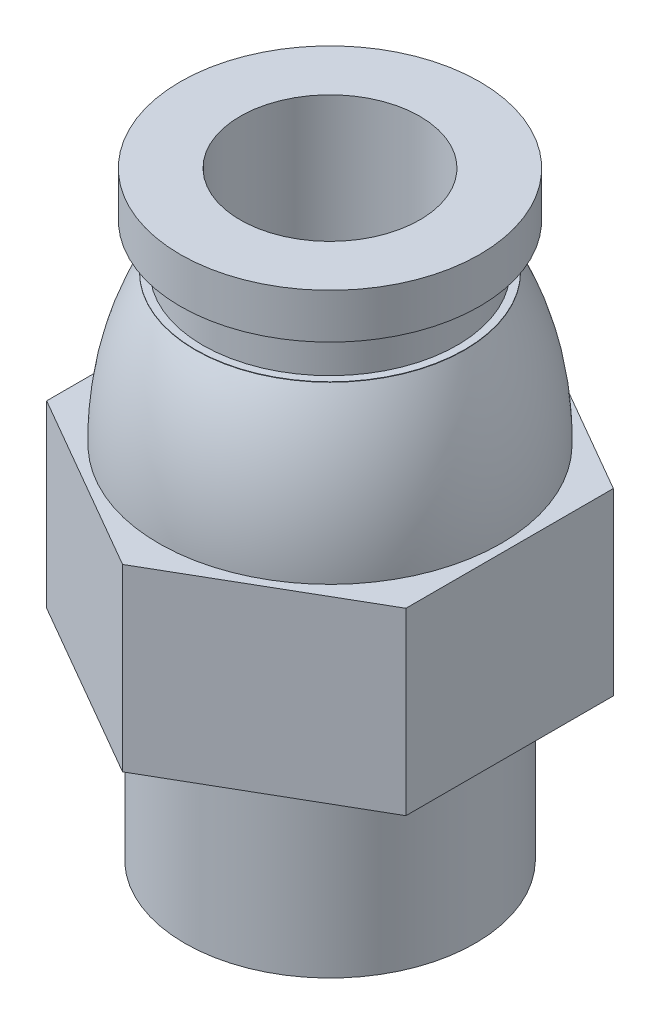
ISO-10303-21;
HEADER;
FILE_DESCRIPTION(('STEP AP214'),'2;1');
FILE_NAME('part.step','',(''),(''),'','','');
FILE_SCHEMA(('AUTOMOTIVE_DESIGN { 1 0 10303 214 1 1 1 1 }'));
ENDSEC;
DATA;
#1=APPLICATION_CONTEXT('core data for automotive mechanical design processes');
#2=APPLICATION_PROTOCOL_DEFINITION('international standard','automotive_design',2000,#1);
#3=PRODUCT_CONTEXT('',#1,'mechanical');
#4=PRODUCT('Part','Part','',(#3));
#5=PRODUCT_RELATED_PRODUCT_CATEGORY('part','',(#4));
#6=PRODUCT_DEFINITION_FORMATION('','',#4);
#7=PRODUCT_DEFINITION_CONTEXT('part definition',#1,'design');
#8=PRODUCT_DEFINITION('design','',#6,#7);
#9=PRODUCT_DEFINITION_SHAPE('','',#8);
#10=(LENGTH_UNIT() NAMED_UNIT(*) SI_UNIT(.MILLI.,.METRE.));
#11=(NAMED_UNIT(*) PLANE_ANGLE_UNIT() SI_UNIT($,.RADIAN.));
#12=(NAMED_UNIT(*) SI_UNIT($,.STERADIAN.) SOLID_ANGLE_UNIT());
#13=UNCERTAINTY_MEASURE_WITH_UNIT(LENGTH_MEASURE(1.E-05),#10,'distance_accuracy_value','');
#14=(GEOMETRIC_REPRESENTATION_CONTEXT(3) GLOBAL_UNCERTAINTY_ASSIGNED_CONTEXT((#13)) GLOBAL_UNIT_ASSIGNED_CONTEXT((#10,
#11,#12)) REPRESENTATION_CONTEXT('',''));
#15=CARTESIAN_POINT('',(0.,0.,0.));
#16=DIRECTION('',(0.,0.,1.));
#17=DIRECTION('',(1.,0.,0.));
#18=AXIS2_PLACEMENT_3D('',#15,#16,#17);
#19=CARTESIAN_POINT('',(0.,17.,0.));
#20=DIRECTION('',(0.,-1.,0.));
#21=DIRECTION('',(0.,0.,-1.));
#22=AXIS2_PLACEMENT_3D('',#19,#20,#21);
#23=CYLINDRICAL_SURFACE('',#22,4.5);
#24=CARTESIAN_POINT('',(0.,17.,0.));
#25=DIRECTION('',(0.,1.,0.));
#26=DIRECTION('',(0.,0.,1.));
#27=AXIS2_PLACEMENT_3D('',#24,#25,#26);
#28=CIRCLE('',#27,4.5);
#29=CARTESIAN_POINT('',(0.,17.,4.5));
#30=VERTEX_POINT('',#29);
#31=EDGE_CURVE('E138',#30,#30,#28,.T.);
#32=ORIENTED_EDGE('',*,*,#31,.F.);
#33=EDGE_LOOP('',(#32));
#34=FACE_BOUND('',#33,.T.);
#35=CARTESIAN_POINT('',(0.,16.9863492427653,0.));
#36=DIRECTION('',(0.,-1.,0.));
#37=DIRECTION('',(1.,0.,0.));
#38=AXIS2_PLACEMENT_3D('',#35,#36,#37);
#39=CIRCLE('',#38,4.5);
#40=CARTESIAN_POINT('',(4.5,16.9863492427653,0.));
#41=VERTEX_POINT('',#40);
#42=EDGE_CURVE('E11',#41,#41,#39,.T.);
#43=ORIENTED_EDGE('',*,*,#42,.F.);
#44=EDGE_LOOP('',(#43));
#45=FACE_BOUND('',#44,.T.);
#46=ADVANCED_FACE('F47',(#34,#45),#23,.T.);
#47=CARTESIAN_POINT('',(0.,17.,0.));
#48=DIRECTION('',(0.,1.,0.));
#49=DIRECTION('',(0.,0.,1.));
#50=AXIS2_PLACEMENT_3D('',#47,#48,#49);
#51=PLANE('',#50);
#52=CARTESIAN_POINT('',(0.,17.,0.));
#53=DIRECTION('',(0.,1.,0.));
#54=DIRECTION('',(0.,0.,1.));
#55=AXIS2_PLACEMENT_3D('',#52,#53,#54);
#56=CIRCLE('',#55,4.25);
#57=CARTESIAN_POINT('',(0.,17.,4.25));
#58=VERTEX_POINT('',#57);
#59=EDGE_CURVE('E157',#58,#58,#56,.T.);
#60=ORIENTED_EDGE('',*,*,#59,.F.);
#61=EDGE_LOOP('',(#60));
#62=FACE_BOUND('',#61,.T.);
#63=ORIENTED_EDGE('',*,*,#31,.T.);
#64=EDGE_LOOP('',(#63));
#65=FACE_BOUND('',#64,.T.);
#66=ADVANCED_FACE('F180',(#62,#65),#51,.T.);
#67=CARTESIAN_POINT('',(0.,18.,0.));
#68=DIRECTION('',(0.,-1.,0.));
#69=DIRECTION('',(0.,0.,-1.));
#70=AXIS2_PLACEMENT_3D('',#67,#68,#69);
#71=CYLINDRICAL_SURFACE('',#70,4.25);
#72=CARTESIAN_POINT('',(0.,18.,0.));
#73=DIRECTION('',(0.,1.,0.));
#74=DIRECTION('',(0.,0.,1.));
#75=AXIS2_PLACEMENT_3D('',#72,#73,#74);
#76=CIRCLE('',#75,4.25);
#77=CARTESIAN_POINT('',(0.,18.,4.25));
#78=VERTEX_POINT('',#77);
#79=EDGE_CURVE('E229',#78,#78,#76,.T.);
#80=ORIENTED_EDGE('',*,*,#79,.F.);
#81=EDGE_LOOP('',(#80));
#82=FACE_BOUND('',#81,.T.);
#83=ORIENTED_EDGE('',*,*,#59,.T.);
#84=EDGE_LOOP('',(#83));
#85=FACE_BOUND('',#84,.T.);
#86=ADVANCED_FACE('F187',(#82,#85),#71,.T.);
#87=CARTESIAN_POINT('',(0.,18.,0.));
#88=DIRECTION('',(0.,1.,0.));
#89=DIRECTION('',(0.,0.,1.));
#90=AXIS2_PLACEMENT_3D('',#87,#88,#89);
#91=PLANE('',#90);
#92=CARTESIAN_POINT('',(0.,18.,0.));
#93=DIRECTION('',(0.,1.,0.));
#94=DIRECTION('',(0.,0.,1.));
#95=AXIS2_PLACEMENT_3D('',#92,#93,#94);
#96=CIRCLE('',#95,3.75);
#97=CARTESIAN_POINT('',(0.,18.,3.75));
#98=VERTEX_POINT('',#97);
#99=EDGE_CURVE('E56',#98,#98,#96,.T.);
#100=ORIENTED_EDGE('',*,*,#99,.F.);
#101=EDGE_LOOP('',(#100));
#102=FACE_BOUND('',#101,.T.);
#103=ORIENTED_EDGE('',*,*,#79,.T.);
#104=EDGE_LOOP('',(#103));
#105=FACE_BOUND('',#104,.T.);
#106=ADVANCED_FACE('F272',(#102,#105),#91,.T.);
#107=CARTESIAN_POINT('',(0.,18.5,0.));
#108=DIRECTION('',(0.,-1.,0.));
#109=DIRECTION('',(0.,0.,-1.));
#110=AXIS2_PLACEMENT_3D('',#107,#108,#109);
#111=CYLINDRICAL_SURFACE('',#110,3.75);
#112=CARTESIAN_POINT('',(0.,18.5,0.));
#113=DIRECTION('',(0.,1.,0.));
#114=DIRECTION('',(0.,0.,1.));
#115=AXIS2_PLACEMENT_3D('',#112,#113,#114);
#116=CIRCLE('',#115,3.75);
#117=CARTESIAN_POINT('',(0.,18.5,3.75));
#118=VERTEX_POINT('',#117);
#119=EDGE_CURVE('E234',#118,#118,#116,.T.);
#120=ORIENTED_EDGE('',*,*,#119,.F.);
#121=EDGE_LOOP('',(#120));
#122=FACE_BOUND('',#121,.T.);
#123=ORIENTED_EDGE('',*,*,#99,.T.);
#124=EDGE_LOOP('',(#123));
#125=FACE_BOUND('',#124,.T.);
#126=ADVANCED_FACE('F268',(#122,#125),#111,.T.);
#127=CARTESIAN_POINT('',(0.,20.,0.));
#128=DIRECTION('',(0.,-1.,0.));
#129=DIRECTION('',(0.,0.,-1.));
#130=AXIS2_PLACEMENT_3D('',#127,#128,#129);
#131=CYLINDRICAL_SURFACE('',#130,5.);
#132=CARTESIAN_POINT('',(0.,20.,0.));
#133=DIRECTION('',(0.,1.,0.));
#134=DIRECTION('',(0.,0.,1.));
#135=AXIS2_PLACEMENT_3D('',#132,#133,#134);
#136=CIRCLE('',#135,5.);
#137=CARTESIAN_POINT('',(0.,20.,5.));
#138=VERTEX_POINT('',#137);
#139=EDGE_CURVE('E239',#138,#138,#136,.T.);
#140=ORIENTED_EDGE('',*,*,#139,.F.);
#141=EDGE_LOOP('',(#140));
#142=FACE_BOUND('',#141,.T.);
#143=CARTESIAN_POINT('',(0.,18.5,0.));
#144=DIRECTION('',(0.,1.,0.));
#145=DIRECTION('',(0.,0.,1.));
#146=AXIS2_PLACEMENT_3D('',#143,#144,#145);
#147=CIRCLE('',#146,5.);
#148=CARTESIAN_POINT('',(0.,18.5,5.));
#149=VERTEX_POINT('',#148);
#150=EDGE_CURVE('E240',#149,#149,#147,.T.);
#151=ORIENTED_EDGE('',*,*,#150,.T.);
#152=EDGE_LOOP('',(#151));
#153=FACE_BOUND('',#152,.T.);
#154=ADVANCED_FACE('F262',(#142,#153),#131,.T.);
#155=CARTESIAN_POINT('',(0.,20.,0.));
#156=DIRECTION('',(0.,1.,0.));
#157=DIRECTION('',(0.,0.,1.));
#158=AXIS2_PLACEMENT_3D('',#155,#156,#157);
#159=PLANE('',#158);
#160=CARTESIAN_POINT('',(0.,20.,0.));
#161=DIRECTION('',(0.,-1.,0.));
#162=DIRECTION('',(0.,0.,-1.));
#163=AXIS2_PLACEMENT_3D('',#160,#161,#162);
#164=CIRCLE('',#163,3.);
#165=CARTESIAN_POINT('',(0.,20.,-3.));
#166=VERTEX_POINT('',#165);
#167=EDGE_CURVE('E248',#166,#166,#164,.T.);
#168=ORIENTED_EDGE('',*,*,#167,.T.);
#169=EDGE_LOOP('',(#168));
#170=FACE_BOUND('',#169,.T.);
#171=ORIENTED_EDGE('',*,*,#139,.T.);
#172=EDGE_LOOP('',(#171));
#173=FACE_BOUND('',#172,.T.);
#174=ADVANCED_FACE('F260',(#170,#173),#159,.T.);
#175=CARTESIAN_POINT('',(0.,18.5,0.));
#176=DIRECTION('',(0.,1.,0.));
#177=DIRECTION('',(0.,0.,1.));
#178=AXIS2_PLACEMENT_3D('',#175,#176,#177);
#179=PLANE('',#178);
#180=ORIENTED_EDGE('',*,*,#119,.T.);
#181=EDGE_LOOP('',(#180));
#182=FACE_BOUND('',#181,.T.);
#183=ORIENTED_EDGE('',*,*,#150,.F.);
#184=EDGE_LOOP('',(#183));
#185=FACE_BOUND('',#184,.T.);
#186=ADVANCED_FACE('F174',(#182,#185),#179,.F.);
#187=CARTESIAN_POINT('',(-4.5,16.9863492427653,0.));
#188=CARTESIAN_POINT('',(-5.75676714383066,14.6775989770754,0.));
#189=CARTESIAN_POINT('',(-5.71614298009977,12.,0.));
#190=B_SPLINE_CURVE_WITH_KNOTS('',2,(#187,#188,#189),.UNSPECIFIED.,.F.,.F.,(3,3),(0.,1.),.UNSPECIFIED.);
#191=CARTESIAN_POINT('',(0.,12.,0.));
#192=DIRECTION('',(0.,-1.,0.));
#193=AXIS1_PLACEMENT('',#191,#192);
#194=SURFACE_OF_REVOLUTION('',#190,#193);
#195=CARTESIAN_POINT('',(0.,12.,0.));
#196=DIRECTION('',(0.,-1.,0.));
#197=DIRECTION('',(1.,0.,0.));
#198=AXIS2_PLACEMENT_3D('',#195,#196,#197);
#199=CIRCLE('',#198,5.71614298009977);
#200=CARTESIAN_POINT('',(5.71614298009977,12.,0.));
#201=VERTEX_POINT('',#200);
#202=EDGE_CURVE('E243',#201,#201,#199,.T.);
#203=ORIENTED_EDGE('',*,*,#202,.F.);
#204=EDGE_LOOP('',(#203));
#205=FACE_BOUND('',#204,.T.);
#206=ORIENTED_EDGE('',*,*,#42,.T.);
#207=EDGE_LOOP('',(#206));
#208=FACE_BOUND('',#207,.T.);
#209=ADVANCED_FACE('F164',(#205,#208),#194,.T.);
#210=CARTESIAN_POINT('',(0.,0.,0.));
#211=DIRECTION('',(0.,1.,0.));
#212=DIRECTION('',(0.,0.,1.));
#213=AXIS2_PLACEMENT_3D('',#210,#211,#212);
#214=PLANE('',#213);
#215=CARTESIAN_POINT('',(0.,0.,0.));
#216=DIRECTION('',(0.,-1.,0.));
#217=DIRECTION('',(0.,0.,-1.));
#218=AXIS2_PLACEMENT_3D('',#215,#216,#217);
#219=CIRCLE('',#218,3.025);
#220=CARTESIAN_POINT('',(0.,0.,-3.025));
#221=VERTEX_POINT('',#220);
#222=EDGE_CURVE('E351',#221,#221,#219,.T.);
#223=ORIENTED_EDGE('',*,*,#222,.F.);
#224=EDGE_LOOP('',(#223));
#225=FACE_BOUND('',#224,.T.);
#226=CARTESIAN_POINT('',(0.,0.,0.));
#227=DIRECTION('',(0.,1.,0.));
#228=DIRECTION('',(0.,0.,1.));
#229=AXIS2_PLACEMENT_3D('',#226,#227,#228);
#230=CIRCLE('',#229,4.85);
#231=CARTESIAN_POINT('',(0.,0.,4.85));
#232=VERTEX_POINT('',#231);
#233=EDGE_CURVE('E154',#232,#232,#230,.T.);
#234=ORIENTED_EDGE('',*,*,#233,.F.);
#235=EDGE_LOOP('',(#234));
#236=FACE_BOUND('',#235,.T.);
#237=ADVANCED_FACE('F162',(#225,#236),#214,.F.);
#238=CARTESIAN_POINT('',(0.,6.,0.));
#239=DIRECTION('',(0.,-1.,0.));
#240=DIRECTION('',(0.,0.,-1.));
#241=AXIS2_PLACEMENT_3D('',#238,#239,#240);
#242=CYLINDRICAL_SURFACE('',#241,4.85);
#243=CARTESIAN_POINT('',(0.,6.,0.));
#244=DIRECTION('',(0.,1.,0.));
#245=DIRECTION('',(0.,0.,1.));
#246=AXIS2_PLACEMENT_3D('',#243,#244,#245);
#247=CIRCLE('',#246,4.85);
#248=CARTESIAN_POINT('',(0.,6.,4.85));
#249=VERTEX_POINT('',#248);
#250=EDGE_CURVE('E155',#249,#249,#247,.T.);
#251=ORIENTED_EDGE('',*,*,#250,.F.);
#252=EDGE_LOOP('',(#251));
#253=FACE_BOUND('',#252,.T.);
#254=ORIENTED_EDGE('',*,*,#233,.T.);
#255=EDGE_LOOP('',(#254));
#256=FACE_BOUND('',#255,.T.);
#257=ADVANCED_FACE('F49',(#253,#256),#242,.T.);
#258=CARTESIAN_POINT('',(0.,6.,0.));
#259=DIRECTION('',(0.,1.,0.));
#260=DIRECTION('',(0.,0.,1.));
#261=AXIS2_PLACEMENT_3D('',#258,#259,#260);
#262=PLANE('',#261);
#263=ORIENTED_EDGE('',*,*,#250,.T.);
#264=EDGE_LOOP('',(#263));
#265=FACE_BOUND('',#264,.T.);
#266=DIRECTION('',(0.,0.,-1.));
#267=VECTOR('',#266,1.);
#268=CARTESIAN_POINT('',(6.,6.,3.46410161513776));
#269=LINE('',#268,#267);
#270=CARTESIAN_POINT('',(6.,6.,3.46410161513776));
#271=VERTEX_POINT('',#270);
#272=CARTESIAN_POINT('',(6.,6.,-3.46410161513775));
#273=VERTEX_POINT('',#272);
#274=EDGE_CURVE('E134',#271,#273,#269,.T.);
#275=ORIENTED_EDGE('',*,*,#274,.F.);
#276=DIRECTION('',(0.866025403784439,0.,-0.5));
#277=VECTOR('',#276,1.);
#278=CARTESIAN_POINT('',(0.,6.,6.92820323027551));
#279=LINE('',#278,#277);
#280=CARTESIAN_POINT('',(0.,6.,6.92820323027551));
#281=VERTEX_POINT('',#280);
#282=EDGE_CURVE('E93',#281,#271,#279,.T.);
#283=ORIENTED_EDGE('',*,*,#282,.F.);
#284=DIRECTION('',(0.866025403784439,0.,0.5));
#285=VECTOR('',#284,1.);
#286=CARTESIAN_POINT('',(-6.,6.,3.46410161513776));
#287=LINE('',#286,#285);
#288=CARTESIAN_POINT('',(-6.,6.,3.46410161513776));
#289=VERTEX_POINT('',#288);
#290=EDGE_CURVE('E87',#289,#281,#287,.T.);
#291=ORIENTED_EDGE('',*,*,#290,.F.);
#292=DIRECTION('',(0.,0.,1.));
#293=VECTOR('',#292,1.);
#294=CARTESIAN_POINT('',(-6.,6.,-3.46410161513775));
#295=LINE('',#294,#293);
#296=CARTESIAN_POINT('',(-6.,6.,-3.46410161513775));
#297=VERTEX_POINT('',#296);
#298=EDGE_CURVE('E124',#297,#289,#295,.T.);
#299=ORIENTED_EDGE('',*,*,#298,.F.);
#300=DIRECTION('',(-0.866025403784438,0.,0.5));
#301=VECTOR('',#300,1.);
#302=CARTESIAN_POINT('',(0.,6.,-6.92820323027551));
#303=LINE('',#302,#301);
#304=CARTESIAN_POINT('',(0.,6.,-6.92820323027551));
#305=VERTEX_POINT('',#304);
#306=EDGE_CURVE('E140',#305,#297,#303,.T.);
#307=ORIENTED_EDGE('',*,*,#306,.F.);
#308=DIRECTION('',(-0.866025403784438,0.,-0.5));
#309=VECTOR('',#308,1.);
#310=CARTESIAN_POINT('',(6.,6.,-3.46410161513775));
#311=LINE('',#310,#309);
#312=EDGE_CURVE('E137',#273,#305,#311,.T.);
#313=ORIENTED_EDGE('',*,*,#312,.F.);
#314=EDGE_LOOP('',(#275,#283,#291,#299,#307,#313));
#315=FACE_BOUND('',#314,.T.);
#316=ADVANCED_FACE('F171',(#265,#315),#262,.F.);
#317=CARTESIAN_POINT('',(0.,12.,6.92820323027551));
#318=DIRECTION('',(-0.5,0.,-0.866025403784438));
#319=DIRECTION('',(-0.866025403784439,0.,0.5));
#320=AXIS2_PLACEMENT_3D('',#317,#318,#319);
#321=PLANE('',#320);
#322=ORIENTED_EDGE('',*,*,#282,.T.);
#323=DIRECTION('',(0.,-1.,0.));
#324=VECTOR('',#323,1.);
#325=CARTESIAN_POINT('',(6.,12.,3.46410161513776));
#326=LINE('',#325,#324);
#327=CARTESIAN_POINT('',(6.,12.,3.46410161513776));
#328=VERTEX_POINT('',#327);
#329=EDGE_CURVE('E130',#328,#271,#326,.T.);
#330=ORIENTED_EDGE('',*,*,#329,.F.);
#331=DIRECTION('',(0.866025403784439,0.,-0.5));
#332=VECTOR('',#331,1.);
#333=CARTESIAN_POINT('',(0.,12.,6.92820323027551));
#334=LINE('',#333,#332);
#335=CARTESIAN_POINT('',(0.,12.,6.92820323027551));
#336=VERTEX_POINT('',#335);
#337=EDGE_CURVE('E64',#336,#328,#334,.T.);
#338=ORIENTED_EDGE('',*,*,#337,.F.);
#339=DIRECTION('',(0.,-1.,0.));
#340=VECTOR('',#339,1.);
#341=CARTESIAN_POINT('',(0.,12.,6.92820323027551));
#342=LINE('',#341,#340);
#343=EDGE_CURVE('E126',#336,#281,#342,.T.);
#344=ORIENTED_EDGE('',*,*,#343,.T.);
#345=EDGE_LOOP('',(#322,#330,#338,#344));
#346=FACE_BOUND('',#345,.T.);
#347=ADVANCED_FACE('F200',(#346),#321,.F.);
#348=CARTESIAN_POINT('',(-6.,12.,3.46410161513776));
#349=DIRECTION('',(0.5,0.,-0.866025403784439));
#350=DIRECTION('',(-0.866025403784439,0.,-0.5));
#351=AXIS2_PLACEMENT_3D('',#348,#349,#350);
#352=PLANE('',#351);
#353=ORIENTED_EDGE('',*,*,#290,.T.);
#354=ORIENTED_EDGE('',*,*,#343,.F.);
#355=DIRECTION('',(0.866025403784439,0.,0.5));
#356=VECTOR('',#355,1.);
#357=CARTESIAN_POINT('',(-6.,12.,3.46410161513776));
#358=LINE('',#357,#356);
#359=CARTESIAN_POINT('',(-6.,12.,3.46410161513776));
#360=VERTEX_POINT('',#359);
#361=EDGE_CURVE('E114',#360,#336,#358,.T.);
#362=ORIENTED_EDGE('',*,*,#361,.F.);
#363=DIRECTION('',(0.,-1.,0.));
#364=VECTOR('',#363,1.);
#365=CARTESIAN_POINT('',(-6.,12.,3.46410161513776));
#366=LINE('',#365,#364);
#367=EDGE_CURVE('E121',#360,#289,#366,.T.);
#368=ORIENTED_EDGE('',*,*,#367,.T.);
#369=EDGE_LOOP('',(#353,#354,#362,#368));
#370=FACE_BOUND('',#369,.T.);
#371=ADVANCED_FACE('F128',(#370),#352,.F.);
#372=CARTESIAN_POINT('',(-6.,12.,-3.46410161513775));
#373=DIRECTION('',(1.,0.,0.));
#374=DIRECTION('',(0.,0.,-1.));
#375=AXIS2_PLACEMENT_3D('',#372,#373,#374);
#376=PLANE('',#375);
#377=ORIENTED_EDGE('',*,*,#298,.T.);
#378=ORIENTED_EDGE('',*,*,#367,.F.);
#379=DIRECTION('',(0.,0.,1.));
#380=VECTOR('',#379,1.);
#381=CARTESIAN_POINT('',(-6.,12.,-3.46410161513775));
#382=LINE('',#381,#380);
#383=CARTESIAN_POINT('',(-6.,12.,-3.46410161513775));
#384=VERTEX_POINT('',#383);
#385=EDGE_CURVE('E109',#384,#360,#382,.T.);
#386=ORIENTED_EDGE('',*,*,#385,.F.);
#387=DIRECTION('',(0.,-1.,0.));
#388=VECTOR('',#387,1.);
#389=CARTESIAN_POINT('',(-6.,12.,-3.46410161513775));
#390=LINE('',#389,#388);
#391=EDGE_CURVE('E125',#384,#297,#390,.T.);
#392=ORIENTED_EDGE('',*,*,#391,.T.);
#393=EDGE_LOOP('',(#377,#378,#386,#392));
#394=FACE_BOUND('',#393,.T.);
#395=ADVANCED_FACE('F122',(#394),#376,.F.);
#396=CARTESIAN_POINT('',(0.,12.,-6.92820323027551));
#397=DIRECTION('',(0.5,0.,0.866025403784439));
#398=DIRECTION('',(0.866025403784439,0.,-0.5));
#399=AXIS2_PLACEMENT_3D('',#396,#397,#398);
#400=PLANE('',#399);
#401=ORIENTED_EDGE('',*,*,#306,.T.);
#402=ORIENTED_EDGE('',*,*,#391,.F.);
#403=DIRECTION('',(-0.866025403784438,0.,0.5));
#404=VECTOR('',#403,1.);
#405=CARTESIAN_POINT('',(0.,12.,-6.92820323027551));
#406=LINE('',#405,#404);
#407=CARTESIAN_POINT('',(0.,12.,-6.92820323027551));
#408=VERTEX_POINT('',#407);
#409=EDGE_CURVE('E116',#408,#384,#406,.T.);
#410=ORIENTED_EDGE('',*,*,#409,.F.);
#411=DIRECTION('',(0.,-1.,0.));
#412=VECTOR('',#411,1.);
#413=CARTESIAN_POINT('',(0.,12.,-6.92820323027551));
#414=LINE('',#413,#412);
#415=EDGE_CURVE('E149',#408,#305,#414,.T.);
#416=ORIENTED_EDGE('',*,*,#415,.T.);
#417=EDGE_LOOP('',(#401,#402,#410,#416));
#418=FACE_BOUND('',#417,.T.);
#419=ADVANCED_FACE('F208',(#418),#400,.F.);
#420=CARTESIAN_POINT('',(6.,12.,-3.46410161513775));
#421=DIRECTION('',(-0.5,0.,0.866025403784439));
#422=DIRECTION('',(0.866025403784439,0.,0.5));
#423=AXIS2_PLACEMENT_3D('',#420,#421,#422);
#424=PLANE('',#423);
#425=ORIENTED_EDGE('',*,*,#312,.T.);
#426=ORIENTED_EDGE('',*,*,#415,.F.);
#427=DIRECTION('',(-0.866025403784438,0.,-0.5));
#428=VECTOR('',#427,1.);
#429=CARTESIAN_POINT('',(6.,12.,-3.46410161513775));
#430=LINE('',#429,#428);
#431=CARTESIAN_POINT('',(6.,12.,-3.46410161513775));
#432=VERTEX_POINT('',#431);
#433=EDGE_CURVE('E102',#432,#408,#430,.T.);
#434=ORIENTED_EDGE('',*,*,#433,.F.);
#435=DIRECTION('',(0.,-1.,0.));
#436=VECTOR('',#435,1.);
#437=CARTESIAN_POINT('',(6.,12.,-3.46410161513775));
#438=LINE('',#437,#436);
#439=EDGE_CURVE('E152',#432,#273,#438,.T.);
#440=ORIENTED_EDGE('',*,*,#439,.T.);
#441=EDGE_LOOP('',(#425,#426,#434,#440));
#442=FACE_BOUND('',#441,.T.);
#443=ADVANCED_FACE('F211',(#442),#424,.F.);
#444=CARTESIAN_POINT('',(6.,12.,3.46410161513776));
#445=DIRECTION('',(-1.,0.,0.));
#446=DIRECTION('',(0.,0.,1.));
#447=AXIS2_PLACEMENT_3D('',#444,#445,#446);
#448=PLANE('',#447);
#449=ORIENTED_EDGE('',*,*,#274,.T.);
#450=ORIENTED_EDGE('',*,*,#439,.F.);
#451=DIRECTION('',(0.,0.,-1.));
#452=VECTOR('',#451,1.);
#453=CARTESIAN_POINT('',(6.,12.,3.46410161513776));
#454=LINE('',#453,#452);
#455=EDGE_CURVE('E145',#328,#432,#454,.T.);
#456=ORIENTED_EDGE('',*,*,#455,.F.);
#457=ORIENTED_EDGE('',*,*,#329,.T.);
#458=EDGE_LOOP('',(#449,#450,#456,#457));
#459=FACE_BOUND('',#458,.T.);
#460=ADVANCED_FACE('F197',(#459),#448,.F.);
#461=CARTESIAN_POINT('',(0.,12.,0.));
#462=DIRECTION('',(0.,1.,0.));
#463=DIRECTION('',(0.,0.,1.));
#464=AXIS2_PLACEMENT_3D('',#461,#462,#463);
#465=PLANE('',#464);
#466=ORIENTED_EDGE('',*,*,#455,.T.);
#467=ORIENTED_EDGE('',*,*,#433,.T.);
#468=ORIENTED_EDGE('',*,*,#409,.T.);
#469=ORIENTED_EDGE('',*,*,#385,.T.);
#470=ORIENTED_EDGE('',*,*,#361,.T.);
#471=ORIENTED_EDGE('',*,*,#337,.T.);
#472=EDGE_LOOP('',(#466,#467,#468,#469,#470,#471));
#473=FACE_BOUND('',#472,.T.);
#474=ORIENTED_EDGE('',*,*,#202,.T.);
#475=EDGE_LOOP('',(#474));
#476=FACE_BOUND('',#475,.T.);
#477=ADVANCED_FACE('F111',(#473,#476),#465,.T.);
#478=CARTESIAN_POINT('',(0.,0.,0.));
#479=DIRECTION('',(0.,-1.,0.));
#480=DIRECTION('',(0.,0.,-1.));
#481=AXIS2_PLACEMENT_3D('',#478,#479,#480);
#482=CYLINDRICAL_SURFACE('',#481,3.);
#483=ORIENTED_EDGE('',*,*,#167,.F.);
#484=EDGE_LOOP('',(#483));
#485=FACE_BOUND('',#484,.T.);
#486=CARTESIAN_POINT('',(0.,0.0250000000000007,0.));
#487=DIRECTION('',(0.,-1.,0.));
#488=DIRECTION('',(0.,0.,-1.));
#489=AXIS2_PLACEMENT_3D('',#486,#487,#488);
#490=CIRCLE('',#489,3.);
#491=CARTESIAN_POINT('',(0.,0.0250000000000007,-3.));
#492=VERTEX_POINT('',#491);
#493=EDGE_CURVE('E349',#492,#492,#490,.T.);
#494=ORIENTED_EDGE('',*,*,#493,.T.);
#495=EDGE_LOOP('',(#494));
#496=FACE_BOUND('',#495,.T.);
#497=ADVANCED_FACE('F196',(#485,#496),#482,.F.);
#498=CARTESIAN_POINT('',(0.,0.,0.));
#499=DIRECTION('',(0.,-1.,0.));
#500=DIRECTION('',(0.,0.,-1.));
#501=AXIS2_PLACEMENT_3D('',#498,#499,#500);
#502=CONICAL_SURFACE('',#501,3.025,0.785398163397448);
#503=ORIENTED_EDGE('',*,*,#493,.F.);
#504=EDGE_LOOP('',(#503));
#505=FACE_BOUND('',#504,.T.);
#506=ORIENTED_EDGE('',*,*,#222,.T.);
#507=EDGE_LOOP('',(#506));
#508=FACE_BOUND('',#507,.T.);
#509=ADVANCED_FACE('F335',(#505,#508),#502,.F.);
#510=CLOSED_SHELL('',(#46,#66,#86,#106,#126,#154,#174,#186,#209,#237,#257,#316,#347,#371,#395,
#419,#443,#460,#477,#497,#509));
#511=MANIFOLD_SOLID_BREP('B2',#510);
#512=ADVANCED_BREP_SHAPE_REPRESENTATION('',(#18,#511),#14);
#513=SHAPE_DEFINITION_REPRESENTATION(#9,#512);
ENDSEC;
END-ISO-10303-21;
